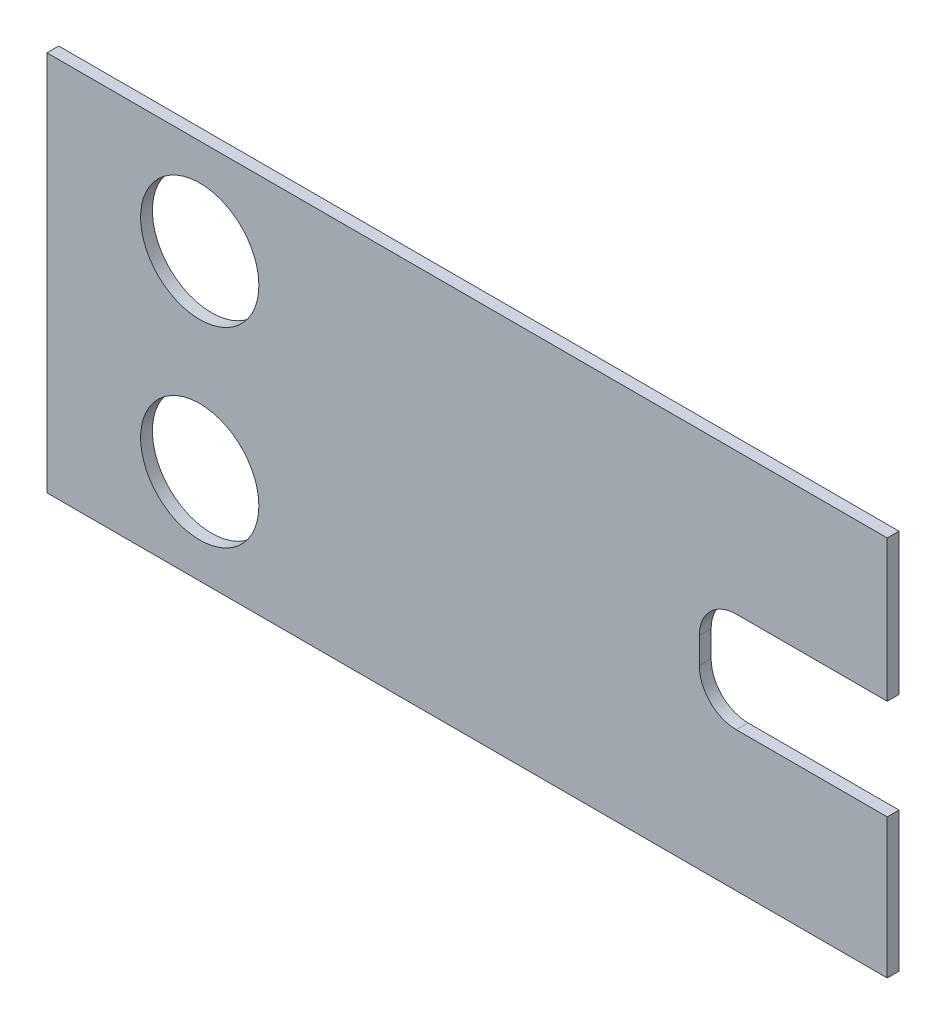
ISO-10303-21;
HEADER;
FILE_DESCRIPTION(('STEP AP214'),'2;1');
FILE_NAME('part.step','',(''),(''),'','','');
FILE_SCHEMA(('AUTOMOTIVE_DESIGN { 1 0 10303 214 1 1 1 1 }'));
ENDSEC;
DATA;
#1=APPLICATION_CONTEXT('core data for automotive mechanical design processes');
#2=APPLICATION_PROTOCOL_DEFINITION('international standard','automotive_design',2000,#1);
#3=PRODUCT_CONTEXT('',#1,'mechanical');
#4=PRODUCT('Part','Part','',(#3));
#5=PRODUCT_RELATED_PRODUCT_CATEGORY('part','',(#4));
#6=PRODUCT_DEFINITION_FORMATION('','',#4);
#7=PRODUCT_DEFINITION_CONTEXT('part definition',#1,'design');
#8=PRODUCT_DEFINITION('design','',#6,#7);
#9=PRODUCT_DEFINITION_SHAPE('','',#8);
#10=(LENGTH_UNIT() NAMED_UNIT(*) SI_UNIT(.MILLI.,.METRE.));
#11=(NAMED_UNIT(*) PLANE_ANGLE_UNIT() SI_UNIT($,.RADIAN.));
#12=(NAMED_UNIT(*) SI_UNIT($,.STERADIAN.) SOLID_ANGLE_UNIT());
#13=UNCERTAINTY_MEASURE_WITH_UNIT(LENGTH_MEASURE(1.E-05),#10,'distance_accuracy_value','');
#14=(GEOMETRIC_REPRESENTATION_CONTEXT(3) GLOBAL_UNCERTAINTY_ASSIGNED_CONTEXT((#13)) GLOBAL_UNIT_ASSIGNED_CONTEXT((#10,
#11,#12)) REPRESENTATION_CONTEXT('',''));
#15=CARTESIAN_POINT('',(0.,0.,0.));
#16=DIRECTION('',(0.,0.,1.));
#17=DIRECTION('',(1.,0.,0.));
#18=AXIS2_PLACEMENT_3D('',#15,#16,#17);
#19=CARTESIAN_POINT('',(34.925,-15.84,0.245));
#20=DIRECTION('',(-1.,0.,0.));
#21=DIRECTION('',(0.,0.,1.));
#22=AXIS2_PLACEMENT_3D('',#19,#20,#21);
#23=PLANE('',#22);
#24=DIRECTION('',(0.,1.,0.));
#25=VECTOR('',#24,1.);
#26=CARTESIAN_POINT('',(34.925,-15.84,-0.245));
#27=LINE('',#26,#25);
#28=CARTESIAN_POINT('',(34.925,-15.84,-0.245));
#29=VERTEX_POINT('',#28);
#30=CARTESIAN_POINT('',(34.925,-10.04,-0.245));
#31=VERTEX_POINT('',#30);
#32=EDGE_CURVE('E144',#29,#31,#27,.T.);
#33=ORIENTED_EDGE('',*,*,#32,.T.);
#34=DIRECTION('',(0.,0.,1.));
#35=VECTOR('',#34,1.);
#36=CARTESIAN_POINT('',(34.925,-10.04,-0.245));
#37=LINE('',#36,#35);
#38=CARTESIAN_POINT('',(34.925,-10.04,0.245));
#39=VERTEX_POINT('',#38);
#40=EDGE_CURVE('E149',#31,#39,#37,.T.);
#41=ORIENTED_EDGE('',*,*,#40,.T.);
#42=DIRECTION('',(0.,1.,0.));
#43=VECTOR('',#42,1.);
#44=CARTESIAN_POINT('',(34.925,-15.84,0.245));
#45=LINE('',#44,#43);
#46=CARTESIAN_POINT('',(34.925,-15.84,0.245));
#47=VERTEX_POINT('',#46);
#48=EDGE_CURVE('E86',#47,#39,#45,.T.);
#49=ORIENTED_EDGE('',*,*,#48,.F.);
#50=DIRECTION('',(0.,0.,-1.));
#51=VECTOR('',#50,1.);
#52=CARTESIAN_POINT('',(34.925,-15.84,0.245));
#53=LINE('',#52,#51);
#54=EDGE_CURVE('E11',#47,#29,#53,.T.);
#55=ORIENTED_EDGE('',*,*,#54,.T.);
#56=EDGE_LOOP('',(#33,#41,#49,#55));
#57=FACE_BOUND('',#56,.T.);
#58=ADVANCED_FACE('F34',(#57),#23,.F.);
#59=CARTESIAN_POINT('',(0.,-15.84,0.245));
#60=DIRECTION('',(0.,1.,0.));
#61=DIRECTION('',(0.,0.,1.));
#62=AXIS2_PLACEMENT_3D('',#59,#60,#61);
#63=PLANE('',#62);
#64=DIRECTION('',(1.,0.,0.));
#65=VECTOR('',#64,1.);
#66=CARTESIAN_POINT('',(0.,-15.84,-0.245));
#67=LINE('',#66,#65);
#68=CARTESIAN_POINT('',(0.,-15.84,-0.245));
#69=VERTEX_POINT('',#68);
#70=EDGE_CURVE('E145',#69,#29,#67,.T.);
#71=ORIENTED_EDGE('',*,*,#70,.T.);
#72=ORIENTED_EDGE('',*,*,#54,.F.);
#73=DIRECTION('',(1.,0.,0.));
#74=VECTOR('',#73,1.);
#75=CARTESIAN_POINT('',(0.,-15.84,0.245));
#76=LINE('',#75,#74);
#77=CARTESIAN_POINT('',(0.,-15.84,0.245));
#78=VERTEX_POINT('',#77);
#79=EDGE_CURVE('E155',#78,#47,#76,.T.);
#80=ORIENTED_EDGE('',*,*,#79,.F.);
#81=DIRECTION('',(0.,0.,-1.));
#82=VECTOR('',#81,1.);
#83=CARTESIAN_POINT('',(0.,-15.84,0.245));
#84=LINE('',#83,#82);
#85=EDGE_CURVE('E156',#78,#69,#84,.T.);
#86=ORIENTED_EDGE('',*,*,#85,.T.);
#87=EDGE_LOOP('',(#71,#72,#80,#86));
#88=FACE_BOUND('',#87,.T.);
#89=ADVANCED_FACE('F36',(#88),#63,.F.);
#90=CARTESIAN_POINT('',(34.925,-5.88,0.245));
#91=VERTEX_POINT('',#90);
#92=CARTESIAN_POINT('',(34.925,0.,0.245));
#93=VERTEX_POINT('',#92);
#94=EDGE_CURVE('E137',#91,#93,#45,.T.);
#95=ORIENTED_EDGE('',*,*,#94,.F.);
#96=DIRECTION('',(0.,0.,1.));
#97=VECTOR('',#96,1.);
#98=CARTESIAN_POINT('',(34.925,-5.88,-0.245));
#99=LINE('',#98,#97);
#100=CARTESIAN_POINT('',(34.925,-5.88,-0.245));
#101=VERTEX_POINT('',#100);
#102=EDGE_CURVE('E124',#101,#91,#99,.T.);
#103=ORIENTED_EDGE('',*,*,#102,.F.);
#104=CARTESIAN_POINT('',(34.925,0.,-0.245));
#105=VERTEX_POINT('',#104);
#106=EDGE_CURVE('E135',#101,#105,#27,.T.);
#107=ORIENTED_EDGE('',*,*,#106,.T.);
#108=DIRECTION('',(0.,0.,-1.));
#109=VECTOR('',#108,1.);
#110=CARTESIAN_POINT('',(34.925,0.,0.245));
#111=LINE('',#110,#109);
#112=EDGE_CURVE('E42',#93,#105,#111,.T.);
#113=ORIENTED_EDGE('',*,*,#112,.F.);
#114=EDGE_LOOP('',(#95,#103,#107,#113));
#115=FACE_BOUND('',#114,.T.);
#116=ADVANCED_FACE('F133',(#115),#23,.F.);
#117=CARTESIAN_POINT('',(34.925,0.,0.245));
#118=DIRECTION('',(0.,-1.,0.));
#119=DIRECTION('',(0.,0.,-1.));
#120=AXIS2_PLACEMENT_3D('',#117,#118,#119);
#121=PLANE('',#120);
#122=DIRECTION('',(-1.,0.,0.));
#123=VECTOR('',#122,1.);
#124=CARTESIAN_POINT('',(34.925,0.,-0.245));
#125=LINE('',#124,#123);
#126=CARTESIAN_POINT('',(0.,0.,-0.245));
#127=VERTEX_POINT('',#126);
#128=EDGE_CURVE('E143',#105,#127,#125,.T.);
#129=ORIENTED_EDGE('',*,*,#128,.T.);
#130=DIRECTION('',(0.,0.,-1.));
#131=VECTOR('',#130,1.);
#132=CARTESIAN_POINT('',(0.,0.,0.245));
#133=LINE('',#132,#131);
#134=CARTESIAN_POINT('',(0.,0.,0.245));
#135=VERTEX_POINT('',#134);
#136=EDGE_CURVE('E158',#135,#127,#133,.T.);
#137=ORIENTED_EDGE('',*,*,#136,.F.);
#138=DIRECTION('',(-1.,0.,0.));
#139=VECTOR('',#138,1.);
#140=CARTESIAN_POINT('',(34.925,0.,0.245));
#141=LINE('',#140,#139);
#142=EDGE_CURVE('E163',#93,#135,#141,.T.);
#143=ORIENTED_EDGE('',*,*,#142,.F.);
#144=ORIENTED_EDGE('',*,*,#112,.T.);
#145=EDGE_LOOP('',(#129,#137,#143,#144));
#146=FACE_BOUND('',#145,.T.);
#147=ADVANCED_FACE('F161',(#146),#121,.F.);
#148=CARTESIAN_POINT('',(0.,0.,0.245));
#149=DIRECTION('',(1.,0.,0.));
#150=DIRECTION('',(0.,0.,-1.));
#151=AXIS2_PLACEMENT_3D('',#148,#149,#150);
#152=PLANE('',#151);
#153=DIRECTION('',(0.,-1.,0.));
#154=VECTOR('',#153,1.);
#155=CARTESIAN_POINT('',(0.,0.,-0.245));
#156=LINE('',#155,#154);
#157=EDGE_CURVE('E79',#127,#69,#156,.T.);
#158=ORIENTED_EDGE('',*,*,#157,.T.);
#159=ORIENTED_EDGE('',*,*,#85,.F.);
#160=DIRECTION('',(0.,-1.,0.));
#161=VECTOR('',#160,1.);
#162=CARTESIAN_POINT('',(0.,0.,0.245));
#163=LINE('',#162,#161);
#164=EDGE_CURVE('E58',#135,#78,#163,.T.);
#165=ORIENTED_EDGE('',*,*,#164,.F.);
#166=ORIENTED_EDGE('',*,*,#136,.T.);
#167=EDGE_LOOP('',(#158,#159,#165,#166));
#168=FACE_BOUND('',#167,.T.);
#169=ADVANCED_FACE('F214',(#168),#152,.F.);
#170=CARTESIAN_POINT('',(0.,0.,0.245));
#171=DIRECTION('',(0.,0.,1.));
#172=DIRECTION('',(1.,0.,0.));
#173=AXIS2_PLACEMENT_3D('',#170,#171,#172);
#174=PLANE('',#173);
#175=CARTESIAN_POINT('',(6.35,-3.96875,0.245));
#176=DIRECTION('',(0.,0.,1.));
#177=DIRECTION('',(1.,0.,0.));
#178=AXIS2_PLACEMENT_3D('',#175,#176,#177);
#179=CIRCLE('',#178,2.45745);
#180=CARTESIAN_POINT('',(8.80745,-3.96875,0.245));
#181=VERTEX_POINT('',#180);
#182=EDGE_CURVE('E205',#181,#181,#179,.T.);
#183=ORIENTED_EDGE('',*,*,#182,.F.);
#184=EDGE_LOOP('',(#183));
#185=FACE_BOUND('',#184,.T.);
#186=CARTESIAN_POINT('',(6.35,-11.90625,0.245));
#187=DIRECTION('',(0.,0.,1.));
#188=DIRECTION('',(1.,0.,0.));
#189=AXIS2_PLACEMENT_3D('',#186,#187,#188);
#190=CIRCLE('',#189,2.45745);
#191=CARTESIAN_POINT('',(8.80745,-11.90625,0.245));
#192=VERTEX_POINT('',#191);
#193=EDGE_CURVE('E199',#192,#192,#190,.T.);
#194=ORIENTED_EDGE('',*,*,#193,.F.);
#195=EDGE_LOOP('',(#194));
#196=FACE_BOUND('',#195,.T.);
#197=DIRECTION('',(1.,0.,0.));
#198=VECTOR('',#197,1.);
#199=CARTESIAN_POINT('',(28.6494217151748,-10.04,0.245));
#200=LINE('',#199,#198);
#201=CARTESIAN_POINT('',(28.6494217151748,-10.04,0.245));
#202=VERTEX_POINT('',#201);
#203=EDGE_CURVE('E129',#202,#39,#200,.T.);
#204=ORIENTED_EDGE('',*,*,#203,.F.);
#205=CARTESIAN_POINT('',(28.6494217151748,-8.50557828482519,0.245));
#206=DIRECTION('',(0.,0.,1.));
#207=DIRECTION('',(1.,0.,0.));
#208=AXIS2_PLACEMENT_3D('',#205,#206,#207);
#209=CIRCLE('',#208,1.53442171517481);
#210=CARTESIAN_POINT('',(27.115,-8.50557828482519,0.245));
#211=VERTEX_POINT('',#210);
#212=EDGE_CURVE('E177',#211,#202,#209,.T.);
#213=ORIENTED_EDGE('',*,*,#212,.F.);
#214=DIRECTION('',(0.,-1.,0.));
#215=VECTOR('',#214,1.);
#216=CARTESIAN_POINT('',(27.115,-7.41442171517481,0.245));
#217=LINE('',#216,#215);
#218=CARTESIAN_POINT('',(27.115,-7.41442171517481,0.245));
#219=VERTEX_POINT('',#218);
#220=EDGE_CURVE('E180',#219,#211,#217,.T.);
#221=ORIENTED_EDGE('',*,*,#220,.F.);
#222=CARTESIAN_POINT('',(28.6494217151748,-7.41442171517481,0.245));
#223=DIRECTION('',(0.,0.,1.));
#224=DIRECTION('',(1.,0.,0.));
#225=AXIS2_PLACEMENT_3D('',#222,#223,#224);
#226=CIRCLE('',#225,1.53442171517481);
#227=CARTESIAN_POINT('',(28.6494217151748,-5.88,0.245));
#228=VERTEX_POINT('',#227);
#229=EDGE_CURVE('E183',#228,#219,#226,.T.);
#230=ORIENTED_EDGE('',*,*,#229,.F.);
#231=DIRECTION('',(-1.,0.,0.));
#232=VECTOR('',#231,1.);
#233=CARTESIAN_POINT('',(34.925,-5.88,0.245));
#234=LINE('',#233,#232);
#235=EDGE_CURVE('E186',#91,#228,#234,.T.);
#236=ORIENTED_EDGE('',*,*,#235,.F.);
#237=ORIENTED_EDGE('',*,*,#94,.T.);
#238=ORIENTED_EDGE('',*,*,#142,.T.);
#239=ORIENTED_EDGE('',*,*,#164,.T.);
#240=ORIENTED_EDGE('',*,*,#79,.T.);
#241=ORIENTED_EDGE('',*,*,#48,.T.);
#242=EDGE_LOOP('',(#204,#213,#221,#230,#236,#237,#238,#239,#240,#241));
#243=FACE_BOUND('',#242,.T.);
#244=ADVANCED_FACE('F211',(#185,#196,#243),#174,.T.);
#245=CARTESIAN_POINT('',(0.,0.,-0.245));
#246=DIRECTION('',(0.,0.,1.));
#247=DIRECTION('',(1.,0.,0.));
#248=AXIS2_PLACEMENT_3D('',#245,#246,#247);
#249=PLANE('',#248);
#250=CARTESIAN_POINT('',(6.35,-3.96875,-0.245000000000001));
#251=DIRECTION('',(0.,0.,1.));
#252=DIRECTION('',(1.,0.,0.));
#253=AXIS2_PLACEMENT_3D('',#250,#251,#252);
#254=CIRCLE('',#253,2.45745);
#255=CARTESIAN_POINT('',(8.80745,-3.96875,-0.245000000000001));
#256=VERTEX_POINT('',#255);
#257=EDGE_CURVE('E202',#256,#256,#254,.T.);
#258=ORIENTED_EDGE('',*,*,#257,.T.);
#259=EDGE_LOOP('',(#258));
#260=FACE_BOUND('',#259,.T.);
#261=CARTESIAN_POINT('',(6.35,-11.90625,-0.245000000000001));
#262=DIRECTION('',(0.,0.,1.));
#263=DIRECTION('',(1.,0.,0.));
#264=AXIS2_PLACEMENT_3D('',#261,#262,#263);
#265=CIRCLE('',#264,2.45745);
#266=CARTESIAN_POINT('',(8.80745,-11.90625,-0.245000000000001));
#267=VERTEX_POINT('',#266);
#268=EDGE_CURVE('E188',#267,#267,#265,.T.);
#269=ORIENTED_EDGE('',*,*,#268,.T.);
#270=EDGE_LOOP('',(#269));
#271=FACE_BOUND('',#270,.T.);
#272=CARTESIAN_POINT('',(28.6494217151748,-8.50557828482519,-0.245));
#273=DIRECTION('',(0.,0.,1.));
#274=DIRECTION('',(1.,0.,0.));
#275=AXIS2_PLACEMENT_3D('',#272,#273,#274);
#276=CIRCLE('',#275,1.53442171517481);
#277=CARTESIAN_POINT('',(27.115,-8.50557828482519,-0.245));
#278=VERTEX_POINT('',#277);
#279=CARTESIAN_POINT('',(28.6494217151748,-10.04,-0.245));
#280=VERTEX_POINT('',#279);
#281=EDGE_CURVE('E191',#278,#280,#276,.T.);
#282=ORIENTED_EDGE('',*,*,#281,.T.);
#283=DIRECTION('',(1.,0.,0.));
#284=VECTOR('',#283,1.);
#285=CARTESIAN_POINT('',(28.6494217151748,-10.04,-0.245));
#286=LINE('',#285,#284);
#287=EDGE_CURVE('E138',#280,#31,#286,.T.);
#288=ORIENTED_EDGE('',*,*,#287,.T.);
#289=ORIENTED_EDGE('',*,*,#32,.F.);
#290=ORIENTED_EDGE('',*,*,#70,.F.);
#291=ORIENTED_EDGE('',*,*,#157,.F.);
#292=ORIENTED_EDGE('',*,*,#128,.F.);
#293=ORIENTED_EDGE('',*,*,#106,.F.);
#294=DIRECTION('',(-1.,0.,0.));
#295=VECTOR('',#294,1.);
#296=CARTESIAN_POINT('',(34.925,-5.88,-0.245));
#297=LINE('',#296,#295);
#298=CARTESIAN_POINT('',(28.6494217151748,-5.88,-0.245));
#299=VERTEX_POINT('',#298);
#300=EDGE_CURVE('E120',#101,#299,#297,.T.);
#301=ORIENTED_EDGE('',*,*,#300,.T.);
#302=CARTESIAN_POINT('',(28.6494217151748,-7.41442171517481,-0.245));
#303=DIRECTION('',(0.,0.,1.));
#304=DIRECTION('',(1.,0.,0.));
#305=AXIS2_PLACEMENT_3D('',#302,#303,#304);
#306=CIRCLE('',#305,1.53442171517481);
#307=CARTESIAN_POINT('',(27.115,-7.41442171517481,-0.245));
#308=VERTEX_POINT('',#307);
#309=EDGE_CURVE('E49',#299,#308,#306,.T.);
#310=ORIENTED_EDGE('',*,*,#309,.T.);
#311=DIRECTION('',(0.,-1.,0.));
#312=VECTOR('',#311,1.);
#313=CARTESIAN_POINT('',(27.115,-7.41442171517481,-0.245));
#314=LINE('',#313,#312);
#315=EDGE_CURVE('E193',#308,#278,#314,.T.);
#316=ORIENTED_EDGE('',*,*,#315,.T.);
#317=EDGE_LOOP('',(#282,#288,#289,#290,#291,#292,#293,#301,#310,#316));
#318=FACE_BOUND('',#317,.T.);
#319=ADVANCED_FACE('F142',(#260,#271,#318),#249,.F.);
#320=CARTESIAN_POINT('',(28.6494217151748,-10.04,-0.245));
#321=DIRECTION('',(0.,-1.,0.));
#322=DIRECTION('',(0.,0.,-1.));
#323=AXIS2_PLACEMENT_3D('',#320,#321,#322);
#324=PLANE('',#323);
#325=ORIENTED_EDGE('',*,*,#203,.T.);
#326=ORIENTED_EDGE('',*,*,#40,.F.);
#327=ORIENTED_EDGE('',*,*,#287,.F.);
#328=DIRECTION('',(0.,0.,1.));
#329=VECTOR('',#328,1.);
#330=CARTESIAN_POINT('',(28.6494217151748,-10.04,-0.245));
#331=LINE('',#330,#329);
#332=EDGE_CURVE('E173',#280,#202,#331,.T.);
#333=ORIENTED_EDGE('',*,*,#332,.T.);
#334=EDGE_LOOP('',(#325,#326,#327,#333));
#335=FACE_BOUND('',#334,.T.);
#336=ADVANCED_FACE('F221',(#335),#324,.F.);
#337=CARTESIAN_POINT('',(28.6494217151748,-8.50557828482519,-0.245));
#338=DIRECTION('',(0.,0.,1.));
#339=DIRECTION('',(1.,0.,0.));
#340=AXIS2_PLACEMENT_3D('',#337,#338,#339);
#341=CYLINDRICAL_SURFACE('',#340,1.53442171517481);
#342=ORIENTED_EDGE('',*,*,#212,.T.);
#343=ORIENTED_EDGE('',*,*,#332,.F.);
#344=ORIENTED_EDGE('',*,*,#281,.F.);
#345=DIRECTION('',(0.,0.,1.));
#346=VECTOR('',#345,1.);
#347=CARTESIAN_POINT('',(27.115,-8.50557828482519,-0.245));
#348=LINE('',#347,#346);
#349=EDGE_CURVE('E171',#278,#211,#348,.T.);
#350=ORIENTED_EDGE('',*,*,#349,.T.);
#351=EDGE_LOOP('',(#342,#343,#344,#350));
#352=FACE_BOUND('',#351,.T.);
#353=ADVANCED_FACE('F228',(#352),#341,.F.);
#354=CARTESIAN_POINT('',(27.115,-7.41442171517481,-0.245));
#355=DIRECTION('',(-1.,0.,0.));
#356=DIRECTION('',(0.,0.,1.));
#357=AXIS2_PLACEMENT_3D('',#354,#355,#356);
#358=PLANE('',#357);
#359=ORIENTED_EDGE('',*,*,#220,.T.);
#360=ORIENTED_EDGE('',*,*,#349,.F.);
#361=ORIENTED_EDGE('',*,*,#315,.F.);
#362=DIRECTION('',(0.,0.,1.));
#363=VECTOR('',#362,1.);
#364=CARTESIAN_POINT('',(27.115,-7.41442171517481,-0.245));
#365=LINE('',#364,#363);
#366=EDGE_CURVE('E169',#308,#219,#365,.T.);
#367=ORIENTED_EDGE('',*,*,#366,.T.);
#368=EDGE_LOOP('',(#359,#360,#361,#367));
#369=FACE_BOUND('',#368,.T.);
#370=ADVANCED_FACE('F230',(#369),#358,.F.);
#371=CARTESIAN_POINT('',(28.6494217151748,-7.41442171517481,-0.245));
#372=DIRECTION('',(0.,0.,1.));
#373=DIRECTION('',(1.,0.,0.));
#374=AXIS2_PLACEMENT_3D('',#371,#372,#373);
#375=CYLINDRICAL_SURFACE('',#374,1.53442171517481);
#376=ORIENTED_EDGE('',*,*,#229,.T.);
#377=ORIENTED_EDGE('',*,*,#366,.F.);
#378=ORIENTED_EDGE('',*,*,#309,.F.);
#379=DIRECTION('',(0.,0.,1.));
#380=VECTOR('',#379,1.);
#381=CARTESIAN_POINT('',(28.6494217151748,-5.88,-0.245));
#382=LINE('',#381,#380);
#383=EDGE_CURVE('E126',#299,#228,#382,.T.);
#384=ORIENTED_EDGE('',*,*,#383,.T.);
#385=EDGE_LOOP('',(#376,#377,#378,#384));
#386=FACE_BOUND('',#385,.T.);
#387=ADVANCED_FACE('F232',(#386),#375,.F.);
#388=CARTESIAN_POINT('',(34.925,-5.88,-0.245));
#389=DIRECTION('',(0.,1.,0.));
#390=DIRECTION('',(-1.,0.,0.));
#391=AXIS2_PLACEMENT_3D('',#388,#389,#390);
#392=PLANE('',#391);
#393=ORIENTED_EDGE('',*,*,#235,.T.);
#394=ORIENTED_EDGE('',*,*,#383,.F.);
#395=ORIENTED_EDGE('',*,*,#300,.F.);
#396=ORIENTED_EDGE('',*,*,#102,.T.);
#397=EDGE_LOOP('',(#393,#394,#395,#396));
#398=FACE_BOUND('',#397,.T.);
#399=ADVANCED_FACE('F123',(#398),#392,.F.);
#400=CARTESIAN_POINT('',(6.35,-11.90625,0.245));
#401=DIRECTION('',(0.,0.,1.));
#402=DIRECTION('',(1.,0.,0.));
#403=AXIS2_PLACEMENT_3D('',#400,#401,#402);
#404=CYLINDRICAL_SURFACE('',#403,2.45745);
#405=ORIENTED_EDGE('',*,*,#268,.F.);
#406=EDGE_LOOP('',(#405));
#407=FACE_BOUND('',#406,.T.);
#408=ORIENTED_EDGE('',*,*,#193,.T.);
#409=EDGE_LOOP('',(#408));
#410=FACE_BOUND('',#409,.T.);
#411=ADVANCED_FACE('F239',(#407,#410),#404,.F.);
#412=CARTESIAN_POINT('',(6.35,-3.96875,0.245));
#413=DIRECTION('',(0.,0.,1.));
#414=DIRECTION('',(1.,0.,0.));
#415=AXIS2_PLACEMENT_3D('',#412,#413,#414);
#416=CYLINDRICAL_SURFACE('',#415,2.45745);
#417=ORIENTED_EDGE('',*,*,#257,.F.);
#418=EDGE_LOOP('',(#417));
#419=FACE_BOUND('',#418,.T.);
#420=ORIENTED_EDGE('',*,*,#182,.T.);
#421=EDGE_LOOP('',(#420));
#422=FACE_BOUND('',#421,.T.);
#423=ADVANCED_FACE('F209',(#419,#422),#416,.F.);
#424=CLOSED_SHELL('',(#58,#89,#116,#147,#169,#244,#319,#336,#353,#370,#387,#399,#411,#423));
#425=MANIFOLD_SOLID_BREP('B2',#424);
#426=ADVANCED_BREP_SHAPE_REPRESENTATION('',(#18,#425),#14);
#427=SHAPE_DEFINITION_REPRESENTATION(#9,#426);
ENDSEC;
END-ISO-10303-21;
